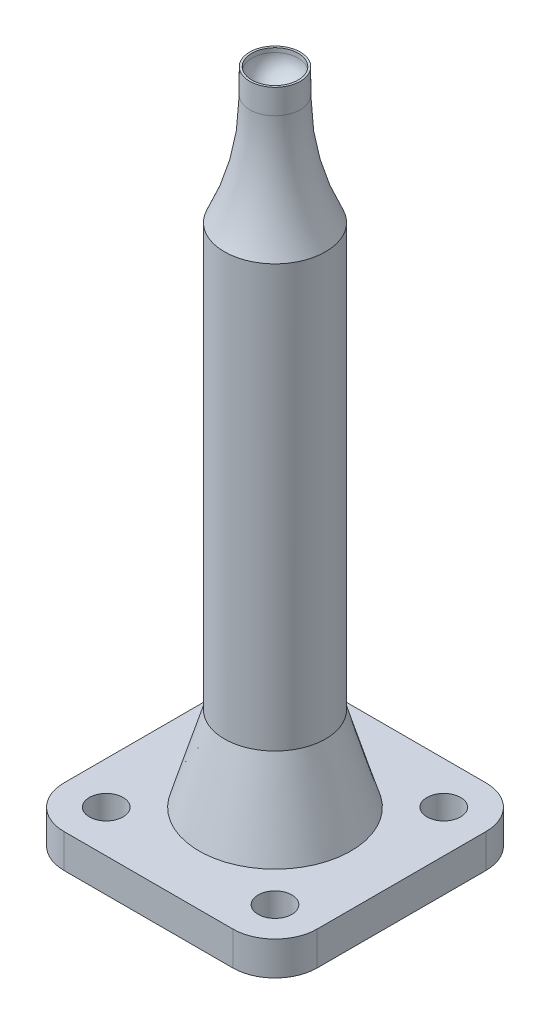
ISO-10303-21;
HEADER;
FILE_DESCRIPTION(('STEP AP214'),'2;1');
FILE_NAME('part.step','',(''),(''),'','','');
FILE_SCHEMA(('AUTOMOTIVE_DESIGN { 1 0 10303 214 1 1 1 1 }'));
ENDSEC;
DATA;
#1=APPLICATION_CONTEXT('core data for automotive mechanical design processes');
#2=APPLICATION_PROTOCOL_DEFINITION('international standard','automotive_design',2000,#1);
#3=PRODUCT_CONTEXT('',#1,'mechanical');
#4=PRODUCT('Part','Part','',(#3));
#5=PRODUCT_RELATED_PRODUCT_CATEGORY('part','',(#4));
#6=PRODUCT_DEFINITION_FORMATION('','',#4);
#7=PRODUCT_DEFINITION_CONTEXT('part definition',#1,'design');
#8=PRODUCT_DEFINITION('design','',#6,#7);
#9=PRODUCT_DEFINITION_SHAPE('','',#8);
#10=(LENGTH_UNIT() NAMED_UNIT(*) SI_UNIT(.MILLI.,.METRE.));
#11=(NAMED_UNIT(*) PLANE_ANGLE_UNIT() SI_UNIT($,.RADIAN.));
#12=(NAMED_UNIT(*) SI_UNIT($,.STERADIAN.) SOLID_ANGLE_UNIT());
#13=UNCERTAINTY_MEASURE_WITH_UNIT(LENGTH_MEASURE(1.E-05),#10,'distance_accuracy_value','');
#14=(GEOMETRIC_REPRESENTATION_CONTEXT(3) GLOBAL_UNCERTAINTY_ASSIGNED_CONTEXT((#13)) GLOBAL_UNIT_ASSIGNED_CONTEXT((#10,
#11,#12)) REPRESENTATION_CONTEXT('',''));
#15=CARTESIAN_POINT('',(0.,0.,0.));
#16=DIRECTION('',(0.,0.,1.));
#17=DIRECTION('',(1.,0.,0.));
#18=AXIS2_PLACEMENT_3D('',#15,#16,#17);
#19=CARTESIAN_POINT('',(0.,4.,0.));
#20=DIRECTION('',(0.,-1.,0.));
#21=DIRECTION('',(0.,0.,-1.));
#22=AXIS2_PLACEMENT_3D('',#19,#20,#21);
#23=PLANE('',#22);
#24=CARTESIAN_POINT('',(0.,4.,0.));
#25=DIRECTION('',(0.,-1.,0.));
#26=DIRECTION('',(0.,0.,-1.));
#27=AXIS2_PLACEMENT_3D('',#24,#25,#26);
#28=CIRCLE('',#27,9.);
#29=CARTESIAN_POINT('',(0.,4.,-9.));
#30=VERTEX_POINT('',#29);
#31=EDGE_CURVE('E13',#30,#30,#28,.T.);
#32=ORIENTED_EDGE('',*,*,#31,.T.);
#33=EDGE_LOOP('',(#32));
#34=FACE_BOUND('',#33,.T.);
#35=DIRECTION('',(1.,0.,0.));
#36=VECTOR('',#35,1.);
#37=CARTESIAN_POINT('',(-15.,4.,15.));
#38=LINE('',#37,#36);
#39=CARTESIAN_POINT('',(-10.,4.,15.));
#40=VERTEX_POINT('',#39);
#41=CARTESIAN_POINT('',(10.,4.,15.));
#42=VERTEX_POINT('',#41);
#43=EDGE_CURVE('E157',#40,#42,#38,.T.);
#44=ORIENTED_EDGE('',*,*,#43,.T.);
#45=CARTESIAN_POINT('',(10.,4.,10.));
#46=DIRECTION('',(0.,-1.,0.));
#47=DIRECTION('',(0.,0.,-1.));
#48=AXIS2_PLACEMENT_3D('',#45,#46,#47);
#49=CIRCLE('',#48,5.);
#50=CARTESIAN_POINT('',(15.,4.,10.));
#51=VERTEX_POINT('',#50);
#52=EDGE_CURVE('E186',#42,#51,#49,.F.);
#53=ORIENTED_EDGE('',*,*,#52,.T.);
#54=DIRECTION('',(0.,0.,-1.));
#55=VECTOR('',#54,1.);
#56=CARTESIAN_POINT('',(15.,4.,15.));
#57=LINE('',#56,#55);
#58=CARTESIAN_POINT('',(15.,4.,-10.));
#59=VERTEX_POINT('',#58);
#60=EDGE_CURVE('E135',#51,#59,#57,.T.);
#61=ORIENTED_EDGE('',*,*,#60,.T.);
#62=CARTESIAN_POINT('',(10.,4.,-10.));
#63=DIRECTION('',(0.,-1.,0.));
#64=DIRECTION('',(0.,0.,-1.));
#65=AXIS2_PLACEMENT_3D('',#62,#63,#64);
#66=CIRCLE('',#65,5.);
#67=CARTESIAN_POINT('',(10.,4.,-15.));
#68=VERTEX_POINT('',#67);
#69=EDGE_CURVE('E181',#59,#68,#66,.F.);
#70=ORIENTED_EDGE('',*,*,#69,.T.);
#71=DIRECTION('',(-1.,0.,0.));
#72=VECTOR('',#71,1.);
#73=CARTESIAN_POINT('',(-15.,4.,-15.));
#74=LINE('',#73,#72);
#75=CARTESIAN_POINT('',(-10.,4.,-15.));
#76=VERTEX_POINT('',#75);
#77=EDGE_CURVE('E336',#68,#76,#74,.T.);
#78=ORIENTED_EDGE('',*,*,#77,.T.);
#79=CARTESIAN_POINT('',(-10.,4.,-10.));
#80=DIRECTION('',(0.,-1.,0.));
#81=DIRECTION('',(0.,0.,-1.));
#82=AXIS2_PLACEMENT_3D('',#79,#80,#81);
#83=CIRCLE('',#82,5.);
#84=CARTESIAN_POINT('',(-15.,4.,-10.));
#85=VERTEX_POINT('',#84);
#86=EDGE_CURVE('E69',#76,#85,#83,.F.);
#87=ORIENTED_EDGE('',*,*,#86,.T.);
#88=DIRECTION('',(0.,0.,1.));
#89=VECTOR('',#88,1.);
#90=CARTESIAN_POINT('',(-15.,4.,15.));
#91=LINE('',#90,#89);
#92=CARTESIAN_POINT('',(-15.,4.,10.));
#93=VERTEX_POINT('',#92);
#94=EDGE_CURVE('E338',#85,#93,#91,.T.);
#95=ORIENTED_EDGE('',*,*,#94,.T.);
#96=CARTESIAN_POINT('',(-10.,4.,10.));
#97=DIRECTION('',(0.,-1.,0.));
#98=DIRECTION('',(0.,0.,-1.));
#99=AXIS2_PLACEMENT_3D('',#96,#97,#98);
#100=CIRCLE('',#99,5.);
#101=EDGE_CURVE('E178',#93,#40,#100,.F.);
#102=ORIENTED_EDGE('',*,*,#101,.T.);
#103=EDGE_LOOP('',(#44,#53,#61,#70,#78,#87,#95,#102));
#104=FACE_BOUND('',#103,.T.);
#105=CARTESIAN_POINT('',(-10.,4.,-10.));
#106=DIRECTION('',(0.,1.,0.));
#107=DIRECTION('',(0.,0.,1.));
#108=AXIS2_PLACEMENT_3D('',#105,#106,#107);
#109=CIRCLE('',#108,2.);
#110=CARTESIAN_POINT('',(-10.,4.,-8.));
#111=VERTEX_POINT('',#110);
#112=EDGE_CURVE('E146',#111,#111,#109,.T.);
#113=ORIENTED_EDGE('',*,*,#112,.F.);
#114=EDGE_LOOP('',(#113));
#115=FACE_BOUND('',#114,.T.);
#116=CARTESIAN_POINT('',(10.,4.,-10.));
#117=DIRECTION('',(0.,1.,0.));
#118=DIRECTION('',(0.,0.,1.));
#119=AXIS2_PLACEMENT_3D('',#116,#117,#118);
#120=CIRCLE('',#119,2.);
#121=CARTESIAN_POINT('',(10.,4.,-8.));
#122=VERTEX_POINT('',#121);
#123=EDGE_CURVE('E324',#122,#122,#120,.T.);
#124=ORIENTED_EDGE('',*,*,#123,.F.);
#125=EDGE_LOOP('',(#124));
#126=FACE_BOUND('',#125,.T.);
#127=CARTESIAN_POINT('',(10.,4.,10.));
#128=DIRECTION('',(0.,1.,0.));
#129=DIRECTION('',(0.,0.,1.));
#130=AXIS2_PLACEMENT_3D('',#127,#128,#129);
#131=CIRCLE('',#130,2.);
#132=CARTESIAN_POINT('',(10.,4.,12.));
#133=VERTEX_POINT('',#132);
#134=EDGE_CURVE('E316',#133,#133,#131,.T.);
#135=ORIENTED_EDGE('',*,*,#134,.F.);
#136=EDGE_LOOP('',(#135));
#137=FACE_BOUND('',#136,.T.);
#138=CARTESIAN_POINT('',(-10.,4.,10.));
#139=DIRECTION('',(0.,1.,0.));
#140=DIRECTION('',(0.,0.,1.));
#141=AXIS2_PLACEMENT_3D('',#138,#139,#140);
#142=CIRCLE('',#141,2.);
#143=CARTESIAN_POINT('',(-10.,4.,12.));
#144=VERTEX_POINT('',#143);
#145=EDGE_CURVE('E308',#144,#144,#142,.T.);
#146=ORIENTED_EDGE('',*,*,#145,.F.);
#147=EDGE_LOOP('',(#146));
#148=FACE_BOUND('',#147,.T.);
#149=ADVANCED_FACE('F45',(#34,#104,#115,#126,#137,#148),#23,.F.);
#150=CARTESIAN_POINT('',(0.,0.,0.));
#151=DIRECTION('',(0.,-1.,0.));
#152=DIRECTION('',(0.,0.,-1.));
#153=AXIS2_PLACEMENT_3D('',#150,#151,#152);
#154=PLANE('',#153);
#155=CARTESIAN_POINT('',(10.,0.,10.));
#156=DIRECTION('',(0.,1.,0.));
#157=DIRECTION('',(0.,0.,1.));
#158=AXIS2_PLACEMENT_3D('',#155,#156,#157);
#159=CIRCLE('',#158,2.);
#160=CARTESIAN_POINT('',(10.,0.,12.));
#161=VERTEX_POINT('',#160);
#162=EDGE_CURVE('E312',#161,#161,#159,.T.);
#163=ORIENTED_EDGE('',*,*,#162,.T.);
#164=EDGE_LOOP('',(#163));
#165=FACE_BOUND('',#164,.T.);
#166=CARTESIAN_POINT('',(-10.,0.,-10.));
#167=DIRECTION('',(0.,1.,0.));
#168=DIRECTION('',(0.,0.,1.));
#169=AXIS2_PLACEMENT_3D('',#166,#167,#168);
#170=CIRCLE('',#169,2.);
#171=CARTESIAN_POINT('',(-10.,0.,-8.));
#172=VERTEX_POINT('',#171);
#173=EDGE_CURVE('E154',#172,#172,#170,.T.);
#174=ORIENTED_EDGE('',*,*,#173,.T.);
#175=EDGE_LOOP('',(#174));
#176=FACE_BOUND('',#175,.T.);
#177=DIRECTION('',(0.,0.,-1.));
#178=VECTOR('',#177,1.);
#179=CARTESIAN_POINT('',(15.,0.,15.));
#180=LINE('',#179,#178);
#181=CARTESIAN_POINT('',(15.,0.,10.));
#182=VERTEX_POINT('',#181);
#183=CARTESIAN_POINT('',(15.,0.,-10.));
#184=VERTEX_POINT('',#183);
#185=EDGE_CURVE('E132',#182,#184,#180,.T.);
#186=ORIENTED_EDGE('',*,*,#185,.F.);
#187=CARTESIAN_POINT('',(10.,0.,10.));
#188=DIRECTION('',(0.,-1.,0.));
#189=DIRECTION('',(0.,0.,-1.));
#190=AXIS2_PLACEMENT_3D('',#187,#188,#189);
#191=CIRCLE('',#190,5.);
#192=CARTESIAN_POINT('',(10.,0.,15.));
#193=VERTEX_POINT('',#192);
#194=EDGE_CURVE('E114',#182,#193,#191,.T.);
#195=ORIENTED_EDGE('',*,*,#194,.T.);
#196=DIRECTION('',(1.,0.,0.));
#197=VECTOR('',#196,1.);
#198=CARTESIAN_POINT('',(-15.,0.,15.));
#199=LINE('',#198,#197);
#200=CARTESIAN_POINT('',(-10.,0.,15.));
#201=VERTEX_POINT('',#200);
#202=EDGE_CURVE('E162',#201,#193,#199,.T.);
#203=ORIENTED_EDGE('',*,*,#202,.F.);
#204=CARTESIAN_POINT('',(-10.,0.,10.));
#205=DIRECTION('',(0.,-1.,0.));
#206=DIRECTION('',(0.,0.,-1.));
#207=AXIS2_PLACEMENT_3D('',#204,#205,#206);
#208=CIRCLE('',#207,5.);
#209=CARTESIAN_POINT('',(-15.,0.,10.));
#210=VERTEX_POINT('',#209);
#211=EDGE_CURVE('E137',#201,#210,#208,.T.);
#212=ORIENTED_EDGE('',*,*,#211,.T.);
#213=DIRECTION('',(0.,0.,1.));
#214=VECTOR('',#213,1.);
#215=CARTESIAN_POINT('',(-15.,0.,15.));
#216=LINE('',#215,#214);
#217=CARTESIAN_POINT('',(-15.,0.,-10.));
#218=VERTEX_POINT('',#217);
#219=EDGE_CURVE('E151',#218,#210,#216,.T.);
#220=ORIENTED_EDGE('',*,*,#219,.F.);
#221=CARTESIAN_POINT('',(-10.,0.,-10.));
#222=DIRECTION('',(0.,-1.,0.));
#223=DIRECTION('',(0.,0.,-1.));
#224=AXIS2_PLACEMENT_3D('',#221,#222,#223);
#225=CIRCLE('',#224,5.);
#226=CARTESIAN_POINT('',(-10.,0.,-15.));
#227=VERTEX_POINT('',#226);
#228=EDGE_CURVE('E126',#218,#227,#225,.T.);
#229=ORIENTED_EDGE('',*,*,#228,.T.);
#230=DIRECTION('',(-1.,0.,0.));
#231=VECTOR('',#230,1.);
#232=CARTESIAN_POINT('',(-15.,0.,-15.));
#233=LINE('',#232,#231);
#234=CARTESIAN_POINT('',(10.,0.,-15.));
#235=VERTEX_POINT('',#234);
#236=EDGE_CURVE('E145',#235,#227,#233,.T.);
#237=ORIENTED_EDGE('',*,*,#236,.F.);
#238=CARTESIAN_POINT('',(10.,0.,-10.));
#239=DIRECTION('',(0.,-1.,0.));
#240=DIRECTION('',(0.,0.,-1.));
#241=AXIS2_PLACEMENT_3D('',#238,#239,#240);
#242=CIRCLE('',#241,5.);
#243=EDGE_CURVE('E143',#235,#184,#242,.T.);
#244=ORIENTED_EDGE('',*,*,#243,.T.);
#245=EDGE_LOOP('',(#186,#195,#203,#212,#220,#229,#237,#244));
#246=FACE_BOUND('',#245,.T.);
#247=CARTESIAN_POINT('',(10.,0.,-10.));
#248=DIRECTION('',(0.,1.,0.));
#249=DIRECTION('',(0.,0.,1.));
#250=AXIS2_PLACEMENT_3D('',#247,#248,#249);
#251=CIRCLE('',#250,2.);
#252=CARTESIAN_POINT('',(10.,0.,-8.));
#253=VERTEX_POINT('',#252);
#254=EDGE_CURVE('E320',#253,#253,#251,.T.);
#255=ORIENTED_EDGE('',*,*,#254,.T.);
#256=EDGE_LOOP('',(#255));
#257=FACE_BOUND('',#256,.T.);
#258=CARTESIAN_POINT('',(-10.,0.,10.));
#259=DIRECTION('',(0.,1.,0.));
#260=DIRECTION('',(0.,0.,1.));
#261=AXIS2_PLACEMENT_3D('',#258,#259,#260);
#262=CIRCLE('',#261,2.);
#263=CARTESIAN_POINT('',(-10.,0.,12.));
#264=VERTEX_POINT('',#263);
#265=EDGE_CURVE('E303',#264,#264,#262,.T.);
#266=ORIENTED_EDGE('',*,*,#265,.T.);
#267=EDGE_LOOP('',(#266));
#268=FACE_BOUND('',#267,.T.);
#269=ADVANCED_FACE('F140',(#165,#176,#246,#257,#268),#154,.T.);
#270=CARTESIAN_POINT('',(15.,4.,15.));
#271=DIRECTION('',(-1.,0.,0.));
#272=DIRECTION('',(0.,0.,1.));
#273=AXIS2_PLACEMENT_3D('',#270,#271,#272);
#274=PLANE('',#273);
#275=ORIENTED_EDGE('',*,*,#60,.F.);
#276=DIRECTION('',(0.,-1.,0.));
#277=VECTOR('',#276,1.);
#278=CARTESIAN_POINT('',(15.,4.,10.));
#279=LINE('',#278,#277);
#280=EDGE_CURVE('E118',#51,#182,#279,.T.);
#281=ORIENTED_EDGE('',*,*,#280,.T.);
#282=ORIENTED_EDGE('',*,*,#185,.T.);
#283=DIRECTION('',(0.,-1.,0.));
#284=VECTOR('',#283,1.);
#285=CARTESIAN_POINT('',(15.,4.,-10.));
#286=LINE('',#285,#284);
#287=EDGE_CURVE('E138',#184,#59,#286,.F.);
#288=ORIENTED_EDGE('',*,*,#287,.T.);
#289=EDGE_LOOP('',(#275,#281,#282,#288));
#290=FACE_BOUND('',#289,.T.);
#291=ADVANCED_FACE('F131',(#290),#274,.F.);
#292=CARTESIAN_POINT('',(-15.,4.,-15.));
#293=DIRECTION('',(0.,0.,1.));
#294=DIRECTION('',(1.,0.,0.));
#295=AXIS2_PLACEMENT_3D('',#292,#293,#294);
#296=PLANE('',#295);
#297=ORIENTED_EDGE('',*,*,#236,.T.);
#298=DIRECTION('',(0.,-1.,0.));
#299=VECTOR('',#298,1.);
#300=CARTESIAN_POINT('',(-10.,4.,-15.));
#301=LINE('',#300,#299);
#302=EDGE_CURVE('E199',#227,#76,#301,.F.);
#303=ORIENTED_EDGE('',*,*,#302,.T.);
#304=ORIENTED_EDGE('',*,*,#77,.F.);
#305=DIRECTION('',(0.,-1.,0.));
#306=VECTOR('',#305,1.);
#307=CARTESIAN_POINT('',(10.,4.,-15.));
#308=LINE('',#307,#306);
#309=EDGE_CURVE('E195',#68,#235,#308,.T.);
#310=ORIENTED_EDGE('',*,*,#309,.T.);
#311=EDGE_LOOP('',(#297,#303,#304,#310));
#312=FACE_BOUND('',#311,.T.);
#313=ADVANCED_FACE('F250',(#312),#296,.F.);
#314=CARTESIAN_POINT('',(-15.,4.,15.));
#315=DIRECTION('',(1.,0.,0.));
#316=DIRECTION('',(0.,0.,-1.));
#317=AXIS2_PLACEMENT_3D('',#314,#315,#316);
#318=PLANE('',#317);
#319=ORIENTED_EDGE('',*,*,#94,.F.);
#320=DIRECTION('',(0.,-1.,0.));
#321=VECTOR('',#320,1.);
#322=CARTESIAN_POINT('',(-15.,4.,-10.));
#323=LINE('',#322,#321);
#324=EDGE_CURVE('E191',#85,#218,#323,.T.);
#325=ORIENTED_EDGE('',*,*,#324,.T.);
#326=ORIENTED_EDGE('',*,*,#219,.T.);
#327=DIRECTION('',(0.,-1.,0.));
#328=VECTOR('',#327,1.);
#329=CARTESIAN_POINT('',(-15.,4.,10.));
#330=LINE('',#329,#328);
#331=EDGE_CURVE('E62',#210,#93,#330,.F.);
#332=ORIENTED_EDGE('',*,*,#331,.T.);
#333=EDGE_LOOP('',(#319,#325,#326,#332));
#334=FACE_BOUND('',#333,.T.);
#335=ADVANCED_FACE('F246',(#334),#318,.F.);
#336=CARTESIAN_POINT('',(-15.,4.,15.));
#337=DIRECTION('',(0.,0.,-1.));
#338=DIRECTION('',(-1.,0.,0.));
#339=AXIS2_PLACEMENT_3D('',#336,#337,#338);
#340=PLANE('',#339);
#341=ORIENTED_EDGE('',*,*,#202,.T.);
#342=DIRECTION('',(0.,-1.,0.));
#343=VECTOR('',#342,1.);
#344=CARTESIAN_POINT('',(10.,4.,15.));
#345=LINE('',#344,#343);
#346=EDGE_CURVE('E119',#193,#42,#345,.F.);
#347=ORIENTED_EDGE('',*,*,#346,.T.);
#348=ORIENTED_EDGE('',*,*,#43,.F.);
#349=DIRECTION('',(0.,-1.,0.));
#350=VECTOR('',#349,1.);
#351=CARTESIAN_POINT('',(-10.,4.,15.));
#352=LINE('',#351,#350);
#353=EDGE_CURVE('E125',#40,#201,#352,.T.);
#354=ORIENTED_EDGE('',*,*,#353,.T.);
#355=EDGE_LOOP('',(#341,#347,#348,#354));
#356=FACE_BOUND('',#355,.T.);
#357=ADVANCED_FACE('F243',(#356),#340,.F.);
#358=CARTESIAN_POINT('',(-10.,4.,-10.));
#359=DIRECTION('',(0.,-1.,0.));
#360=DIRECTION('',(0.,0.,-1.));
#361=AXIS2_PLACEMENT_3D('',#358,#359,#360);
#362=CYLINDRICAL_SURFACE('',#361,2.);
#363=ORIENTED_EDGE('',*,*,#112,.T.);
#364=EDGE_LOOP('',(#363));
#365=FACE_BOUND('',#364,.T.);
#366=ORIENTED_EDGE('',*,*,#173,.F.);
#367=EDGE_LOOP('',(#366));
#368=FACE_BOUND('',#367,.T.);
#369=ADVANCED_FACE('F240',(#365,#368),#362,.F.);
#370=CARTESIAN_POINT('',(10.,4.,-10.));
#371=DIRECTION('',(0.,-1.,0.));
#372=DIRECTION('',(0.,0.,-1.));
#373=AXIS2_PLACEMENT_3D('',#370,#371,#372);
#374=CYLINDRICAL_SURFACE('',#373,2.);
#375=ORIENTED_EDGE('',*,*,#123,.T.);
#376=EDGE_LOOP('',(#375));
#377=FACE_BOUND('',#376,.T.);
#378=ORIENTED_EDGE('',*,*,#254,.F.);
#379=EDGE_LOOP('',(#378));
#380=FACE_BOUND('',#379,.T.);
#381=ADVANCED_FACE('F369',(#377,#380),#374,.F.);
#382=CARTESIAN_POINT('',(10.,4.,10.));
#383=DIRECTION('',(0.,-1.,0.));
#384=DIRECTION('',(0.,0.,-1.));
#385=AXIS2_PLACEMENT_3D('',#382,#383,#384);
#386=CYLINDRICAL_SURFACE('',#385,2.);
#387=ORIENTED_EDGE('',*,*,#134,.T.);
#388=EDGE_LOOP('',(#387));
#389=FACE_BOUND('',#388,.T.);
#390=ORIENTED_EDGE('',*,*,#162,.F.);
#391=EDGE_LOOP('',(#390));
#392=FACE_BOUND('',#391,.T.);
#393=ADVANCED_FACE('F362',(#389,#392),#386,.F.);
#394=CARTESIAN_POINT('',(-10.,4.,10.));
#395=DIRECTION('',(0.,-1.,0.));
#396=DIRECTION('',(0.,0.,-1.));
#397=AXIS2_PLACEMENT_3D('',#394,#395,#396);
#398=CYLINDRICAL_SURFACE('',#397,2.);
#399=ORIENTED_EDGE('',*,*,#145,.T.);
#400=EDGE_LOOP('',(#399));
#401=FACE_BOUND('',#400,.T.);
#402=ORIENTED_EDGE('',*,*,#265,.F.);
#403=EDGE_LOOP('',(#402));
#404=FACE_BOUND('',#403,.T.);
#405=ADVANCED_FACE('F259',(#401,#404),#398,.F.);
#406=CARTESIAN_POINT('',(10.,4.,10.));
#407=DIRECTION('',(0.,-1.,0.));
#408=DIRECTION('',(0.,0.,-1.));
#409=AXIS2_PLACEMENT_3D('',#406,#407,#408);
#410=CYLINDRICAL_SURFACE('',#409,5.);
#411=ORIENTED_EDGE('',*,*,#52,.F.);
#412=ORIENTED_EDGE('',*,*,#346,.F.);
#413=ORIENTED_EDGE('',*,*,#194,.F.);
#414=ORIENTED_EDGE('',*,*,#280,.F.);
#415=EDGE_LOOP('',(#411,#412,#413,#414));
#416=FACE_BOUND('',#415,.T.);
#417=ADVANCED_FACE('F117',(#416),#410,.T.);
#418=CARTESIAN_POINT('',(-10.,4.,-10.));
#419=DIRECTION('',(0.,-1.,0.));
#420=DIRECTION('',(0.,0.,-1.));
#421=AXIS2_PLACEMENT_3D('',#418,#419,#420);
#422=CYLINDRICAL_SURFACE('',#421,5.);
#423=ORIENTED_EDGE('',*,*,#86,.F.);
#424=ORIENTED_EDGE('',*,*,#302,.F.);
#425=ORIENTED_EDGE('',*,*,#228,.F.);
#426=ORIENTED_EDGE('',*,*,#324,.F.);
#427=EDGE_LOOP('',(#423,#424,#425,#426));
#428=FACE_BOUND('',#427,.T.);
#429=ADVANCED_FACE('F258',(#428),#422,.T.);
#430=CARTESIAN_POINT('',(10.,4.,-10.));
#431=DIRECTION('',(0.,-1.,0.));
#432=DIRECTION('',(0.,0.,-1.));
#433=AXIS2_PLACEMENT_3D('',#430,#431,#432);
#434=CYLINDRICAL_SURFACE('',#433,5.);
#435=ORIENTED_EDGE('',*,*,#69,.F.);
#436=ORIENTED_EDGE('',*,*,#287,.F.);
#437=ORIENTED_EDGE('',*,*,#243,.F.);
#438=ORIENTED_EDGE('',*,*,#309,.F.);
#439=EDGE_LOOP('',(#435,#436,#437,#438));
#440=FACE_BOUND('',#439,.T.);
#441=ADVANCED_FACE('F262',(#440),#434,.T.);
#442=CARTESIAN_POINT('',(-10.,4.,10.));
#443=DIRECTION('',(0.,-1.,0.));
#444=DIRECTION('',(0.,0.,-1.));
#445=AXIS2_PLACEMENT_3D('',#442,#443,#444);
#446=CYLINDRICAL_SURFACE('',#445,5.);
#447=ORIENTED_EDGE('',*,*,#101,.F.);
#448=ORIENTED_EDGE('',*,*,#331,.F.);
#449=ORIENTED_EDGE('',*,*,#211,.F.);
#450=ORIENTED_EDGE('',*,*,#353,.F.);
#451=EDGE_LOOP('',(#447,#448,#449,#450));
#452=FACE_BOUND('',#451,.T.);
#453=ADVANCED_FACE('F266',(#452),#446,.T.);
#454=CARTESIAN_POINT('',(0.,64.,0.));
#455=DIRECTION('',(0.,-1.,0.));
#456=DIRECTION('',(0.,0.,-1.));
#457=AXIS2_PLACEMENT_3D('',#454,#455,#456);
#458=CYLINDRICAL_SURFACE('',#457,6.);
#459=CARTESIAN_POINT('',(0.,14.,0.));
#460=DIRECTION('',(0.,-1.,0.));
#461=DIRECTION('',(0.,0.,-1.));
#462=AXIS2_PLACEMENT_3D('',#459,#460,#461);
#463=CIRCLE('',#462,6.);
#464=CARTESIAN_POINT('',(0.,14.,-6.));
#465=VERTEX_POINT('',#464);
#466=EDGE_CURVE('E55',#465,#465,#463,.F.);
#467=ORIENTED_EDGE('',*,*,#466,.T.);
#468=EDGE_LOOP('',(#467));
#469=FACE_BOUND('',#468,.T.);
#470=CARTESIAN_POINT('',(0.,64.,0.));
#471=DIRECTION('',(0.,1.,0.));
#472=DIRECTION('',(0.,0.,1.));
#473=AXIS2_PLACEMENT_3D('',#470,#471,#472);
#474=CIRCLE('',#473,6.);
#475=CARTESIAN_POINT('',(0.,64.,6.));
#476=VERTEX_POINT('',#475);
#477=EDGE_CURVE('E288',#476,#476,#474,.T.);
#478=ORIENTED_EDGE('',*,*,#477,.F.);
#479=EDGE_LOOP('',(#478));
#480=FACE_BOUND('',#479,.T.);
#481=ADVANCED_FACE('F217',(#469,#480),#458,.T.);
#482=CARTESIAN_POINT('',(0.,80.,0.));
#483=DIRECTION('',(0.,-1.,0.));
#484=DIRECTION('',(0.,0.,-1.));
#485=AXIS2_PLACEMENT_3D('',#482,#483,#484);
#486=CYLINDRICAL_SURFACE('',#485,3.);
#487=CARTESIAN_POINT('',(0.,77.076696830622,0.));
#488=DIRECTION('',(0.,-1.,0.));
#489=DIRECTION('',(0.,0.,-1.));
#490=AXIS2_PLACEMENT_3D('',#487,#488,#489);
#491=CIRCLE('',#490,3.);
#492=CARTESIAN_POINT('',(0.,77.076696830622,-3.));
#493=VERTEX_POINT('',#492);
#494=EDGE_CURVE('E202',#493,#493,#491,.F.);
#495=ORIENTED_EDGE('',*,*,#494,.T.);
#496=EDGE_LOOP('',(#495));
#497=FACE_BOUND('',#496,.T.);
#498=CARTESIAN_POINT('',(0.,80.,0.));
#499=DIRECTION('',(0.,1.,0.));
#500=DIRECTION('',(0.,0.,1.));
#501=AXIS2_PLACEMENT_3D('',#498,#499,#500);
#502=CIRCLE('',#501,3.);
#503=CARTESIAN_POINT('',(0.,80.,3.));
#504=VERTEX_POINT('',#503);
#505=EDGE_CURVE('E296',#504,#504,#502,.T.);
#506=ORIENTED_EDGE('',*,*,#505,.F.);
#507=EDGE_LOOP('',(#506));
#508=FACE_BOUND('',#507,.T.);
#509=ADVANCED_FACE('F282',(#497,#508),#486,.T.);
#510=CARTESIAN_POINT('',(0.,80.,0.));
#511=DIRECTION('',(0.,1.,0.));
#512=DIRECTION('',(0.,0.,1.));
#513=AXIS2_PLACEMENT_3D('',#510,#511,#512);
#514=PLANE('',#513);
#515=CARTESIAN_POINT('',(0.,80.,0.));
#516=DIRECTION('',(0.,1.,0.));
#517=DIRECTION('',(0.,0.,1.));
#518=AXIS2_PLACEMENT_3D('',#515,#516,#517);
#519=CIRCLE('',#518,2.75);
#520=CARTESIAN_POINT('',(0.,80.,2.75));
#521=VERTEX_POINT('',#520);
#522=EDGE_CURVE('E299',#521,#521,#519,.T.);
#523=ORIENTED_EDGE('',*,*,#522,.F.);
#524=EDGE_LOOP('',(#523));
#525=FACE_BOUND('',#524,.T.);
#526=ORIENTED_EDGE('',*,*,#505,.T.);
#527=EDGE_LOOP('',(#526));
#528=FACE_BOUND('',#527,.T.);
#529=ADVANCED_FACE('F274',(#525,#528),#514,.T.);
#530=CARTESIAN_POINT('',(0.,77.076696830622,0.));
#531=DIRECTION('',(0.,-1.,0.));
#532=DIRECTION('',(0.,0.,-1.));
#533=AXIS2_PLACEMENT_3D('',#530,#531,#532);
#534=TOROIDAL_SURFACE('',#533,33.,30.);
#535=ORIENTED_EDGE('',*,*,#477,.T.);
#536=EDGE_LOOP('',(#535));
#537=FACE_BOUND('',#536,.T.);
#538=ORIENTED_EDGE('',*,*,#494,.F.);
#539=EDGE_LOOP('',(#538));
#540=FACE_BOUND('',#539,.T.);
#541=ADVANCED_FACE('F271',(#537,#540),#534,.F.);
#542=CARTESIAN_POINT('',(0.,77.,0.));
#543=DIRECTION('',(0.,1.,0.));
#544=DIRECTION('',(0.,0.,1.));
#545=AXIS2_PLACEMENT_3D('',#542,#543,#544);
#546=CYLINDRICAL_SURFACE('',#545,2.75);
#547=CARTESIAN_POINT('',(0.,79.5,0.));
#548=DIRECTION('',(0.,1.,0.));
#549=DIRECTION('',(0.,0.,1.));
#550=AXIS2_PLACEMENT_3D('',#547,#548,#549);
#551=CIRCLE('',#550,2.75);
#552=CARTESIAN_POINT('',(0.,79.5,2.75));
#553=VERTEX_POINT('',#552);
#554=EDGE_CURVE('E210',#553,#553,#551,.F.);
#555=ORIENTED_EDGE('',*,*,#554,.T.);
#556=EDGE_LOOP('',(#555));
#557=FACE_BOUND('',#556,.T.);
#558=ORIENTED_EDGE('',*,*,#522,.T.);
#559=EDGE_LOOP('',(#558));
#560=FACE_BOUND('',#559,.T.);
#561=ADVANCED_FACE('F273',(#557,#560),#546,.F.);
#562=CARTESIAN_POINT('',(0.,77.,0.));
#563=DIRECTION('',(0.,1.,0.));
#564=DIRECTION('',(0.,0.,1.));
#565=AXIS2_PLACEMENT_3D('',#562,#563,#564);
#566=PLANE('',#565);
#567=CARTESIAN_POINT('',(0.,77.,0.));
#568=DIRECTION('',(0.,1.,0.));
#569=DIRECTION('',(0.,0.,1.));
#570=AXIS2_PLACEMENT_3D('',#567,#568,#569);
#571=CIRCLE('',#570,0.25);
#572=CARTESIAN_POINT('',(0.,77.,0.25));
#573=VERTEX_POINT('',#572);
#574=EDGE_CURVE('E206',#573,#573,#571,.T.);
#575=ORIENTED_EDGE('',*,*,#574,.T.);
#576=EDGE_LOOP('',(#575));
#577=FACE_BOUND('',#576,.T.);
#578=ADVANCED_FACE('F226',(#577),#566,.T.);
#579=CARTESIAN_POINT('',(0.,79.5,0.));
#580=DIRECTION('',(0.,1.,0.));
#581=DIRECTION('',(0.,0.,1.));
#582=AXIS2_PLACEMENT_3D('',#579,#580,#581);
#583=DEGENERATE_TOROIDAL_SURFACE('',#582,0.25,2.5,.T.);
#584=ORIENTED_EDGE('',*,*,#554,.F.);
#585=EDGE_LOOP('',(#584));
#586=FACE_BOUND('',#585,.T.);
#587=ORIENTED_EDGE('',*,*,#574,.F.);
#588=EDGE_LOOP('',(#587));
#589=FACE_BOUND('',#588,.T.);
#590=ADVANCED_FACE('F221',(#586,#589),#583,.F.);
#591=CARTESIAN_POINT('',(0.,14.,0.));
#592=DIRECTION('',(0.,-1.,0.));
#593=DIRECTION('',(0.,0.,-1.));
#594=AXIS2_PLACEMENT_3D('',#591,#592,#593);
#595=CONICAL_SURFACE('',#594,6.,0.291456794477867);
#596=ORIENTED_EDGE('',*,*,#31,.F.);
#597=EDGE_LOOP('',(#596));
#598=FACE_BOUND('',#597,.T.);
#599=ORIENTED_EDGE('',*,*,#466,.F.);
#600=EDGE_LOOP('',(#599));
#601=FACE_BOUND('',#600,.T.);
#602=ADVANCED_FACE('F48',(#598,#601),#595,.T.);
#603=CLOSED_SHELL('',(#149,#269,#291,#313,#335,#357,#369,#381,#393,#405,#417,#429,#441,#453,
#481,#509,#529,#541,#561,#578,#590,#602));
#604=MANIFOLD_SOLID_BREP('B2',#603);
#605=ADVANCED_BREP_SHAPE_REPRESENTATION('',(#18,#604),#14);
#606=SHAPE_DEFINITION_REPRESENTATION(#9,#605);
ENDSEC;
END-ISO-10303-21;
